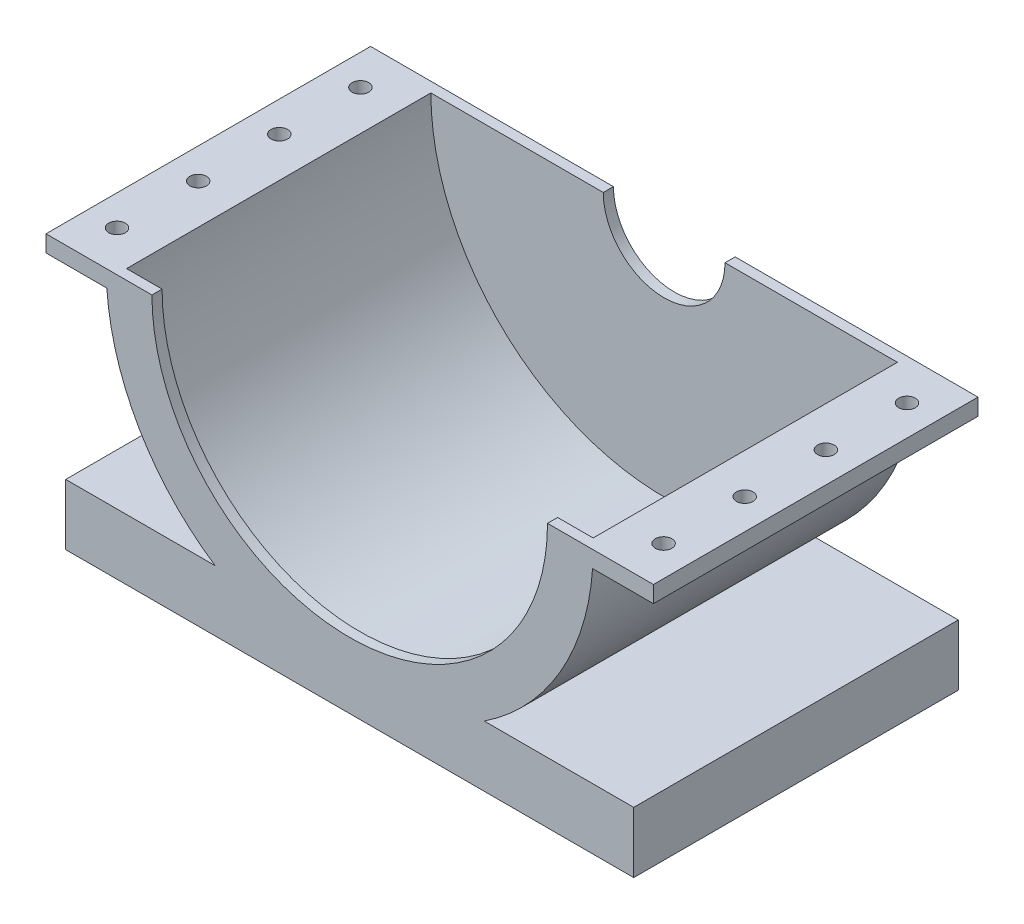
ISO-10303-21;
HEADER;
FILE_DESCRIPTION(('STEP AP214'),'2;1');
FILE_NAME('part.step','',(''),(''),'','','');
FILE_SCHEMA(('AUTOMOTIVE_DESIGN { 1 0 10303 214 1 1 1 1 }'));
ENDSEC;
DATA;
#1=APPLICATION_CONTEXT('core data for automotive mechanical design processes');
#2=APPLICATION_PROTOCOL_DEFINITION('international standard','automotive_design',2000,#1);
#3=PRODUCT_CONTEXT('',#1,'mechanical');
#4=PRODUCT('Part','Part','',(#3));
#5=PRODUCT_RELATED_PRODUCT_CATEGORY('part','',(#4));
#6=PRODUCT_DEFINITION_FORMATION('','',#4);
#7=PRODUCT_DEFINITION_CONTEXT('part definition',#1,'design');
#8=PRODUCT_DEFINITION('design','',#6,#7);
#9=PRODUCT_DEFINITION_SHAPE('','',#8);
#10=(LENGTH_UNIT() NAMED_UNIT(*) SI_UNIT(.MILLI.,.METRE.));
#11=(NAMED_UNIT(*) PLANE_ANGLE_UNIT() SI_UNIT($,.RADIAN.));
#12=(NAMED_UNIT(*) SI_UNIT($,.STERADIAN.) SOLID_ANGLE_UNIT());
#13=UNCERTAINTY_MEASURE_WITH_UNIT(LENGTH_MEASURE(1.E-05),#10,'distance_accuracy_value','');
#14=(GEOMETRIC_REPRESENTATION_CONTEXT(3) GLOBAL_UNCERTAINTY_ASSIGNED_CONTEXT((#13)) GLOBAL_UNIT_ASSIGNED_CONTEXT((#10,
#11,#12)) REPRESENTATION_CONTEXT('',''));
#15=CARTESIAN_POINT('',(0.,0.,0.));
#16=DIRECTION('',(0.,0.,1.));
#17=DIRECTION('',(1.,0.,0.));
#18=AXIS2_PLACEMENT_3D('',#15,#16,#17);
#19=CARTESIAN_POINT('',(-4.875,6.5,8.));
#20=DIRECTION('',(0.,-1.,0.));
#21=DIRECTION('',(0.,0.,-1.));
#22=AXIS2_PLACEMENT_3D('',#19,#20,#21);
#23=PLANE('',#22);
#24=CARTESIAN_POINT('',(6.73597527559211,6.5,7.));
#25=DIRECTION('',(0.,1.,0.));
#26=DIRECTION('',(0.,0.,1.));
#27=AXIS2_PLACEMENT_3D('',#24,#25,#26);
#28=CIRCLE('',#27,0.205000000000002);
#29=CARTESIAN_POINT('',(6.73597527559211,6.5,7.205));
#30=VERTEX_POINT('',#29);
#31=EDGE_CURVE('E262',#30,#30,#28,.T.);
#32=ORIENTED_EDGE('',*,*,#31,.F.);
#33=EDGE_LOOP('',(#32));
#34=FACE_BOUND('',#33,.T.);
#35=CARTESIAN_POINT('',(6.73597527559211,6.5,5.));
#36=DIRECTION('',(0.,1.,0.));
#37=DIRECTION('',(0.,0.,1.));
#38=AXIS2_PLACEMENT_3D('',#35,#36,#37);
#39=CIRCLE('',#38,0.205000000000002);
#40=CARTESIAN_POINT('',(6.73597527559211,6.5,5.205));
#41=VERTEX_POINT('',#40);
#42=EDGE_CURVE('E290',#41,#41,#39,.T.);
#43=ORIENTED_EDGE('',*,*,#42,.F.);
#44=EDGE_LOOP('',(#43));
#45=FACE_BOUND('',#44,.T.);
#46=CARTESIAN_POINT('',(6.73597527559211,6.5,3.));
#47=DIRECTION('',(0.,1.,0.));
#48=DIRECTION('',(0.,0.,1.));
#49=AXIS2_PLACEMENT_3D('',#46,#47,#48);
#50=CIRCLE('',#49,0.205000000000001);
#51=CARTESIAN_POINT('',(6.73597527559211,6.5,3.205));
#52=VERTEX_POINT('',#51);
#53=EDGE_CURVE('E285',#52,#52,#50,.T.);
#54=ORIENTED_EDGE('',*,*,#53,.F.);
#55=EDGE_LOOP('',(#54));
#56=FACE_BOUND('',#55,.T.);
#57=CARTESIAN_POINT('',(6.73597527559211,6.5,1.));
#58=DIRECTION('',(0.,1.,0.));
#59=DIRECTION('',(0.,0.,1.));
#60=AXIS2_PLACEMENT_3D('',#57,#58,#59);
#61=CIRCLE('',#60,0.205000000000001);
#62=CARTESIAN_POINT('',(6.73597527559211,6.5,1.205));
#63=VERTEX_POINT('',#62);
#64=EDGE_CURVE('E281',#63,#63,#61,.T.);
#65=ORIENTED_EDGE('',*,*,#64,.F.);
#66=EDGE_LOOP('',(#65));
#67=FACE_BOUND('',#66,.T.);
#68=DIRECTION('',(-1.,0.,0.));
#69=VECTOR('',#68,1.);
#70=CARTESIAN_POINT('',(-4.875,6.5,0.));
#71=LINE('',#70,#69);
#72=CARTESIAN_POINT('',(7.48597527559211,6.5,0.));
#73=VERTEX_POINT('',#72);
#74=CARTESIAN_POINT('',(1.5,6.5,0.));
#75=VERTEX_POINT('',#74);
#76=EDGE_CURVE('E199',#73,#75,#71,.T.);
#77=ORIENTED_EDGE('',*,*,#76,.T.);
#78=DIRECTION('',(0.,0.,1.));
#79=VECTOR('',#78,1.);
#80=CARTESIAN_POINT('',(1.5,6.5,-3.5));
#81=LINE('',#80,#79);
#82=CARTESIAN_POINT('',(1.5,6.5,0.25));
#83=VERTEX_POINT('',#82);
#84=EDGE_CURVE('E185',#75,#83,#81,.T.);
#85=ORIENTED_EDGE('',*,*,#84,.T.);
#86=DIRECTION('',(-1.,0.,0.));
#87=VECTOR('',#86,1.);
#88=CARTESIAN_POINT('',(5.75,6.5,0.25));
#89=LINE('',#88,#87);
#90=CARTESIAN_POINT('',(5.75,6.5,0.25));
#91=VERTEX_POINT('',#90);
#92=EDGE_CURVE('E306',#91,#83,#89,.T.);
#93=ORIENTED_EDGE('',*,*,#92,.F.);
#94=DIRECTION('',(0.,0.,1.));
#95=VECTOR('',#94,1.);
#96=CARTESIAN_POINT('',(5.75,6.5,0.25));
#97=LINE('',#96,#95);
#98=CARTESIAN_POINT('',(5.75,6.5,7.75));
#99=VERTEX_POINT('',#98);
#100=EDGE_CURVE('E308',#91,#99,#97,.T.);
#101=ORIENTED_EDGE('',*,*,#100,.T.);
#102=DIRECTION('',(-1.,0.,0.));
#103=VECTOR('',#102,1.);
#104=CARTESIAN_POINT('',(5.75,6.5,7.75));
#105=LINE('',#104,#103);
#106=CARTESIAN_POINT('',(4.875,6.5,7.75));
#107=VERTEX_POINT('',#106);
#108=EDGE_CURVE('E305',#99,#107,#105,.T.);
#109=ORIENTED_EDGE('',*,*,#108,.T.);
#110=DIRECTION('',(0.,0.,1.));
#111=VECTOR('',#110,1.);
#112=CARTESIAN_POINT('',(4.875,6.5,4.25));
#113=LINE('',#112,#111);
#114=CARTESIAN_POINT('',(4.875,6.5,8.));
#115=VERTEX_POINT('',#114);
#116=EDGE_CURVE('E85',#107,#115,#113,.T.);
#117=ORIENTED_EDGE('',*,*,#116,.T.);
#118=DIRECTION('',(-1.,0.,0.));
#119=VECTOR('',#118,1.);
#120=CARTESIAN_POINT('',(4.875,6.5,8.));
#121=LINE('',#120,#119);
#122=CARTESIAN_POINT('',(7.48597527559211,6.5,8.));
#123=VERTEX_POINT('',#122);
#124=EDGE_CURVE('E334',#123,#115,#121,.T.);
#125=ORIENTED_EDGE('',*,*,#124,.F.);
#126=DIRECTION('',(0.,0.,-1.));
#127=VECTOR('',#126,1.);
#128=CARTESIAN_POINT('',(7.48597527559211,6.5,8.));
#129=LINE('',#128,#127);
#130=EDGE_CURVE('E207',#123,#73,#129,.T.);
#131=ORIENTED_EDGE('',*,*,#130,.T.);
#132=EDGE_LOOP('',(#77,#85,#93,#101,#109,#117,#125,#131));
#133=FACE_BOUND('',#132,.T.);
#134=ADVANCED_FACE('F61',(#34,#45,#56,#67,#133),#23,.F.);
#135=CARTESIAN_POINT('',(-6.73597527559211,6.5,5.));
#136=DIRECTION('',(0.,-1.,0.));
#137=DIRECTION('',(0.,0.,1.));
#138=AXIS2_PLACEMENT_3D('',#135,#136,#137);
#139=CIRCLE('',#138,0.205000000000002);
#140=CARTESIAN_POINT('',(-6.73597527559211,6.5,5.205));
#141=VERTEX_POINT('',#140);
#142=EDGE_CURVE('E757',#141,#141,#139,.T.);
#143=ORIENTED_EDGE('',*,*,#142,.T.);
#144=EDGE_LOOP('',(#143));
#145=FACE_BOUND('',#144,.T.);
#146=CARTESIAN_POINT('',(-6.73597527559211,6.5,3.));
#147=DIRECTION('',(0.,-1.,0.));
#148=DIRECTION('',(0.,0.,1.));
#149=AXIS2_PLACEMENT_3D('',#146,#147,#148);
#150=CIRCLE('',#149,0.205000000000001);
#151=CARTESIAN_POINT('',(-6.73597527559211,6.5,3.205));
#152=VERTEX_POINT('',#151);
#153=EDGE_CURVE('E758',#152,#152,#150,.T.);
#154=ORIENTED_EDGE('',*,*,#153,.T.);
#155=EDGE_LOOP('',(#154));
#156=FACE_BOUND('',#155,.T.);
#157=CARTESIAN_POINT('',(-6.73597527559211,6.5,1.));
#158=DIRECTION('',(0.,-1.,0.));
#159=DIRECTION('',(0.,0.,1.));
#160=AXIS2_PLACEMENT_3D('',#157,#158,#159);
#161=CIRCLE('',#160,0.205000000000001);
#162=CARTESIAN_POINT('',(-6.73597527559211,6.5,1.205));
#163=VERTEX_POINT('',#162);
#164=EDGE_CURVE('E761',#163,#163,#161,.T.);
#165=ORIENTED_EDGE('',*,*,#164,.T.);
#166=EDGE_LOOP('',(#165));
#167=FACE_BOUND('',#166,.T.);
#168=CARTESIAN_POINT('',(-6.73597527559211,6.5,7.));
#169=DIRECTION('',(0.,-1.,0.));
#170=DIRECTION('',(0.,0.,1.));
#171=AXIS2_PLACEMENT_3D('',#168,#169,#170);
#172=CIRCLE('',#171,0.205000000000002);
#173=CARTESIAN_POINT('',(-6.73597527559211,6.5,7.205));
#174=VERTEX_POINT('',#173);
#175=EDGE_CURVE('E274',#174,#174,#172,.T.);
#176=ORIENTED_EDGE('',*,*,#175,.T.);
#177=EDGE_LOOP('',(#176));
#178=FACE_BOUND('',#177,.T.);
#179=CARTESIAN_POINT('',(-1.5,6.5,0.25));
#180=VERTEX_POINT('',#179);
#181=CARTESIAN_POINT('',(-5.75,6.5,0.25));
#182=VERTEX_POINT('',#181);
#183=EDGE_CURVE('E304',#180,#182,#89,.T.);
#184=ORIENTED_EDGE('',*,*,#183,.F.);
#185=DIRECTION('',(0.,0.,1.));
#186=VECTOR('',#185,1.);
#187=CARTESIAN_POINT('',(-1.5,6.5,-3.5));
#188=LINE('',#187,#186);
#189=CARTESIAN_POINT('',(-1.5,6.5,0.));
#190=VERTEX_POINT('',#189);
#191=EDGE_CURVE('E77',#190,#180,#188,.T.);
#192=ORIENTED_EDGE('',*,*,#191,.F.);
#193=CARTESIAN_POINT('',(-7.48597527559211,6.5,0.));
#194=VERTEX_POINT('',#193);
#195=EDGE_CURVE('E202',#190,#194,#71,.T.);
#196=ORIENTED_EDGE('',*,*,#195,.T.);
#197=DIRECTION('',(0.,0.,-1.));
#198=VECTOR('',#197,1.);
#199=CARTESIAN_POINT('',(-7.48597527559211,6.5,8.));
#200=LINE('',#199,#198);
#201=CARTESIAN_POINT('',(-7.48597527559211,6.5,8.));
#202=VERTEX_POINT('',#201);
#203=EDGE_CURVE('E235',#202,#194,#200,.T.);
#204=ORIENTED_EDGE('',*,*,#203,.F.);
#205=CARTESIAN_POINT('',(-4.875,6.5,8.));
#206=VERTEX_POINT('',#205);
#207=EDGE_CURVE('E333',#206,#202,#121,.T.);
#208=ORIENTED_EDGE('',*,*,#207,.F.);
#209=DIRECTION('',(0.,0.,1.));
#210=VECTOR('',#209,1.);
#211=CARTESIAN_POINT('',(-4.875,6.5,4.25));
#212=LINE('',#211,#210);
#213=CARTESIAN_POINT('',(-4.875,6.5,7.75));
#214=VERTEX_POINT('',#213);
#215=EDGE_CURVE('E295',#214,#206,#212,.T.);
#216=ORIENTED_EDGE('',*,*,#215,.F.);
#217=CARTESIAN_POINT('',(-5.75,6.5,7.75));
#218=VERTEX_POINT('',#217);
#219=EDGE_CURVE('E310',#214,#218,#105,.T.);
#220=ORIENTED_EDGE('',*,*,#219,.T.);
#221=DIRECTION('',(0.,0.,1.));
#222=VECTOR('',#221,1.);
#223=CARTESIAN_POINT('',(-5.75,6.5,0.25));
#224=LINE('',#223,#222);
#225=EDGE_CURVE('E313',#182,#218,#224,.T.);
#226=ORIENTED_EDGE('',*,*,#225,.F.);
#227=EDGE_LOOP('',(#184,#192,#196,#204,#208,#216,#220,#226));
#228=FACE_BOUND('',#227,.T.);
#229=ADVANCED_FACE('F410',(#145,#156,#167,#178,#228),#23,.F.);
#230=CARTESIAN_POINT('',(-7.,0.,8.));
#231=DIRECTION('',(1.,0.,0.));
#232=DIRECTION('',(0.,1.,0.));
#233=AXIS2_PLACEMENT_3D('',#230,#231,#232);
#234=PLANE('',#233);
#235=DIRECTION('',(0.,-1.,0.));
#236=VECTOR('',#235,1.);
#237=CARTESIAN_POINT('',(-7.,0.,0.));
#238=LINE('',#237,#236);
#239=CARTESIAN_POINT('',(-7.,1.5,0.));
#240=VERTEX_POINT('',#239);
#241=CARTESIAN_POINT('',(-7.,0.,0.));
#242=VERTEX_POINT('',#241);
#243=EDGE_CURVE('E316',#240,#242,#238,.T.);
#244=ORIENTED_EDGE('',*,*,#243,.T.);
#245=DIRECTION('',(0.,0.,-1.));
#246=VECTOR('',#245,1.);
#247=CARTESIAN_POINT('',(-7.,0.,8.));
#248=LINE('',#247,#246);
#249=CARTESIAN_POINT('',(-7.,0.,8.));
#250=VERTEX_POINT('',#249);
#251=EDGE_CURVE('E254',#250,#242,#248,.T.);
#252=ORIENTED_EDGE('',*,*,#251,.F.);
#253=DIRECTION('',(0.,-1.,0.));
#254=VECTOR('',#253,1.);
#255=CARTESIAN_POINT('',(-7.,0.,8.));
#256=LINE('',#255,#254);
#257=CARTESIAN_POINT('',(-7.,1.5,8.));
#258=VERTEX_POINT('',#257);
#259=EDGE_CURVE('E221',#258,#250,#256,.T.);
#260=ORIENTED_EDGE('',*,*,#259,.F.);
#261=DIRECTION('',(0.,0.,-1.));
#262=VECTOR('',#261,1.);
#263=CARTESIAN_POINT('',(-7.,1.5,8.));
#264=LINE('',#263,#262);
#265=EDGE_CURVE('E222',#258,#240,#264,.T.);
#266=ORIENTED_EDGE('',*,*,#265,.T.);
#267=EDGE_LOOP('',(#244,#252,#260,#266));
#268=FACE_BOUND('',#267,.T.);
#269=ADVANCED_FACE('F63',(#268),#234,.F.);
#270=CARTESIAN_POINT('',(-7.,0.,8.));
#271=DIRECTION('',(0.,1.,0.));
#272=DIRECTION('',(0.,0.,1.));
#273=AXIS2_PLACEMENT_3D('',#270,#271,#272);
#274=PLANE('',#273);
#275=DIRECTION('',(1.,0.,0.));
#276=VECTOR('',#275,1.);
#277=CARTESIAN_POINT('',(-7.,0.,0.));
#278=LINE('',#277,#276);
#279=CARTESIAN_POINT('',(7.,0.,0.));
#280=VERTEX_POINT('',#279);
#281=EDGE_CURVE('E346',#242,#280,#278,.T.);
#282=ORIENTED_EDGE('',*,*,#281,.T.);
#283=DIRECTION('',(0.,0.,-1.));
#284=VECTOR('',#283,1.);
#285=CARTESIAN_POINT('',(7.,0.,8.));
#286=LINE('',#285,#284);
#287=CARTESIAN_POINT('',(7.,0.,8.));
#288=VERTEX_POINT('',#287);
#289=EDGE_CURVE('E251',#288,#280,#286,.T.);
#290=ORIENTED_EDGE('',*,*,#289,.F.);
#291=DIRECTION('',(1.,0.,0.));
#292=VECTOR('',#291,1.);
#293=CARTESIAN_POINT('',(-7.,0.,8.));
#294=LINE('',#293,#292);
#295=EDGE_CURVE('E321',#250,#288,#294,.T.);
#296=ORIENTED_EDGE('',*,*,#295,.F.);
#297=ORIENTED_EDGE('',*,*,#251,.T.);
#298=EDGE_LOOP('',(#282,#290,#296,#297));
#299=FACE_BOUND('',#298,.T.);
#300=ADVANCED_FACE('F385',(#299),#274,.F.);
#301=CARTESIAN_POINT('',(7.,0.,8.));
#302=DIRECTION('',(-1.,0.,0.));
#303=DIRECTION('',(0.,-1.,0.));
#304=AXIS2_PLACEMENT_3D('',#301,#302,#303);
#305=PLANE('',#304);
#306=DIRECTION('',(0.,1.,0.));
#307=VECTOR('',#306,1.);
#308=CARTESIAN_POINT('',(7.,0.,0.));
#309=LINE('',#308,#307);
#310=CARTESIAN_POINT('',(7.,1.5,0.));
#311=VERTEX_POINT('',#310);
#312=EDGE_CURVE('E348',#280,#311,#309,.T.);
#313=ORIENTED_EDGE('',*,*,#312,.T.);
#314=DIRECTION('',(0.,0.,-1.));
#315=VECTOR('',#314,1.);
#316=CARTESIAN_POINT('',(7.,1.5,8.));
#317=LINE('',#316,#315);
#318=CARTESIAN_POINT('',(7.,1.5,8.));
#319=VERTEX_POINT('',#318);
#320=EDGE_CURVE('E248',#319,#311,#317,.T.);
#321=ORIENTED_EDGE('',*,*,#320,.F.);
#322=DIRECTION('',(0.,1.,0.));
#323=VECTOR('',#322,1.);
#324=CARTESIAN_POINT('',(7.,0.,8.));
#325=LINE('',#324,#323);
#326=EDGE_CURVE('E323',#288,#319,#325,.T.);
#327=ORIENTED_EDGE('',*,*,#326,.F.);
#328=ORIENTED_EDGE('',*,*,#289,.T.);
#329=EDGE_LOOP('',(#313,#321,#327,#328));
#330=FACE_BOUND('',#329,.T.);
#331=ADVANCED_FACE('F379',(#330),#305,.F.);
#332=CARTESIAN_POINT('',(7.,1.5,8.));
#333=DIRECTION('',(0.,-1.,0.));
#334=DIRECTION('',(1.,0.,0.));
#335=AXIS2_PLACEMENT_3D('',#332,#333,#334);
#336=PLANE('',#335);
#337=DIRECTION('',(-1.,0.,0.));
#338=VECTOR('',#337,1.);
#339=CARTESIAN_POINT('',(7.,1.5,0.));
#340=LINE('',#339,#338);
#341=CARTESIAN_POINT('',(3.3166247903554,1.5,0.));
#342=VERTEX_POINT('',#341);
#343=EDGE_CURVE('E350',#311,#342,#340,.T.);
#344=ORIENTED_EDGE('',*,*,#343,.T.);
#345=DIRECTION('',(0.,0.,-1.));
#346=VECTOR('',#345,1.);
#347=CARTESIAN_POINT('',(3.3166247903554,1.5,8.));
#348=LINE('',#347,#346);
#349=CARTESIAN_POINT('',(3.3166247903554,1.5,8.));
#350=VERTEX_POINT('',#349);
#351=EDGE_CURVE('E245',#350,#342,#348,.T.);
#352=ORIENTED_EDGE('',*,*,#351,.F.);
#353=DIRECTION('',(-1.,0.,0.));
#354=VECTOR('',#353,1.);
#355=CARTESIAN_POINT('',(7.,1.5,8.));
#356=LINE('',#355,#354);
#357=EDGE_CURVE('E325',#319,#350,#356,.T.);
#358=ORIENTED_EDGE('',*,*,#357,.F.);
#359=ORIENTED_EDGE('',*,*,#320,.T.);
#360=EDGE_LOOP('',(#344,#352,#358,#359));
#361=FACE_BOUND('',#360,.T.);
#362=ADVANCED_FACE('F377',(#361),#336,.F.);
#363=CARTESIAN_POINT('',(0.,6.5,8.));
#364=DIRECTION('',(0.,0.,-1.));
#365=DIRECTION('',(-1.,0.,0.));
#366=AXIS2_PLACEMENT_3D('',#363,#364,#365);
#367=CYLINDRICAL_SURFACE('',#366,6.);
#368=CARTESIAN_POINT('',(0.,6.5,0.));
#369=DIRECTION('',(0.,0.,1.));
#370=DIRECTION('',(-1.,0.,0.));
#371=AXIS2_PLACEMENT_3D('',#368,#369,#370);
#372=CIRCLE('',#371,6.);
#373=CARTESIAN_POINT('',(5.98597527559211,6.09,0.));
#374=VERTEX_POINT('',#373);
#375=EDGE_CURVE('E352',#342,#374,#372,.T.);
#376=ORIENTED_EDGE('',*,*,#375,.T.);
#377=DIRECTION('',(0.,0.,-1.));
#378=VECTOR('',#377,1.);
#379=CARTESIAN_POINT('',(5.98597527559211,6.09,8.));
#380=LINE('',#379,#378);
#381=CARTESIAN_POINT('',(5.98597527559211,6.09,8.));
#382=VERTEX_POINT('',#381);
#383=EDGE_CURVE('E242',#382,#374,#380,.T.);
#384=ORIENTED_EDGE('',*,*,#383,.F.);
#385=CARTESIAN_POINT('',(0.,6.5,8.));
#386=DIRECTION('',(0.,0.,1.));
#387=DIRECTION('',(-1.,0.,0.));
#388=AXIS2_PLACEMENT_3D('',#385,#386,#387);
#389=CIRCLE('',#388,6.);
#390=EDGE_CURVE('E327',#350,#382,#389,.T.);
#391=ORIENTED_EDGE('',*,*,#390,.F.);
#392=ORIENTED_EDGE('',*,*,#351,.T.);
#393=EDGE_LOOP('',(#376,#384,#391,#392));
#394=FACE_BOUND('',#393,.T.);
#395=ADVANCED_FACE('F365',(#394),#367,.T.);
#396=CARTESIAN_POINT('',(7.48597527559211,6.09,8.));
#397=DIRECTION('',(0.,1.,0.));
#398=DIRECTION('',(-1.,0.,0.));
#399=AXIS2_PLACEMENT_3D('',#396,#397,#398);
#400=PLANE('',#399);
#401=CARTESIAN_POINT('',(6.73597527559211,6.09,7.));
#402=DIRECTION('',(0.,1.,0.));
#403=DIRECTION('',(-1.,0.,0.));
#404=AXIS2_PLACEMENT_3D('',#401,#402,#403);
#405=CIRCLE('',#404,0.205000000000002);
#406=CARTESIAN_POINT('',(6.53097527559211,6.09,7.));
#407=VERTEX_POINT('',#406);
#408=EDGE_CURVE('E193',#407,#407,#405,.T.);
#409=ORIENTED_EDGE('',*,*,#408,.T.);
#410=EDGE_LOOP('',(#409));
#411=FACE_BOUND('',#410,.T.);
#412=CARTESIAN_POINT('',(6.73597527559211,6.09,5.));
#413=DIRECTION('',(0.,1.,0.));
#414=DIRECTION('',(-1.,0.,0.));
#415=AXIS2_PLACEMENT_3D('',#412,#413,#414);
#416=CIRCLE('',#415,0.205000000000002);
#417=CARTESIAN_POINT('',(6.53097527559211,6.09,5.));
#418=VERTEX_POINT('',#417);
#419=EDGE_CURVE('E265',#418,#418,#416,.T.);
#420=ORIENTED_EDGE('',*,*,#419,.T.);
#421=EDGE_LOOP('',(#420));
#422=FACE_BOUND('',#421,.T.);
#423=CARTESIAN_POINT('',(6.73597527559211,6.09,3.));
#424=DIRECTION('',(0.,1.,0.));
#425=DIRECTION('',(-1.,0.,0.));
#426=AXIS2_PLACEMENT_3D('',#423,#424,#425);
#427=CIRCLE('',#426,0.205000000000001);
#428=CARTESIAN_POINT('',(6.53097527559211,6.09,3.));
#429=VERTEX_POINT('',#428);
#430=EDGE_CURVE('E261',#429,#429,#427,.T.);
#431=ORIENTED_EDGE('',*,*,#430,.T.);
#432=EDGE_LOOP('',(#431));
#433=FACE_BOUND('',#432,.T.);
#434=CARTESIAN_POINT('',(6.73597527559211,6.09,1.));
#435=DIRECTION('',(0.,1.,0.));
#436=DIRECTION('',(-1.,0.,0.));
#437=AXIS2_PLACEMENT_3D('',#434,#435,#436);
#438=CIRCLE('',#437,0.205000000000001);
#439=CARTESIAN_POINT('',(6.53097527559211,6.09,1.));
#440=VERTEX_POINT('',#439);
#441=EDGE_CURVE('E258',#440,#440,#438,.T.);
#442=ORIENTED_EDGE('',*,*,#441,.T.);
#443=EDGE_LOOP('',(#442));
#444=FACE_BOUND('',#443,.T.);
#445=DIRECTION('',(1.,0.,0.));
#446=VECTOR('',#445,1.);
#447=CARTESIAN_POINT('',(7.48597527559211,6.09,0.));
#448=LINE('',#447,#446);
#449=CARTESIAN_POINT('',(7.48597527559211,6.09,0.));
#450=VERTEX_POINT('',#449);
#451=EDGE_CURVE('E353',#374,#450,#448,.T.);
#452=ORIENTED_EDGE('',*,*,#451,.T.);
#453=DIRECTION('',(0.,0.,-1.));
#454=VECTOR('',#453,1.);
#455=CARTESIAN_POINT('',(7.48597527559211,6.09,8.));
#456=LINE('',#455,#454);
#457=CARTESIAN_POINT('',(7.48597527559211,6.09,8.));
#458=VERTEX_POINT('',#457);
#459=EDGE_CURVE('E239',#458,#450,#456,.T.);
#460=ORIENTED_EDGE('',*,*,#459,.F.);
#461=DIRECTION('',(1.,0.,0.));
#462=VECTOR('',#461,1.);
#463=CARTESIAN_POINT('',(7.48597527559211,6.09,8.));
#464=LINE('',#463,#462);
#465=EDGE_CURVE('E329',#382,#458,#464,.T.);
#466=ORIENTED_EDGE('',*,*,#465,.F.);
#467=ORIENTED_EDGE('',*,*,#383,.T.);
#468=EDGE_LOOP('',(#452,#460,#466,#467));
#469=FACE_BOUND('',#468,.T.);
#470=ADVANCED_FACE('F369',(#411,#422,#433,#444,#469),#400,.F.);
#471=CARTESIAN_POINT('',(7.48597527559211,6.5,8.));
#472=DIRECTION('',(-1.,0.,0.));
#473=DIRECTION('',(0.,0.,1.));
#474=AXIS2_PLACEMENT_3D('',#471,#472,#473);
#475=PLANE('',#474);
#476=DIRECTION('',(0.,1.,0.));
#477=VECTOR('',#476,1.);
#478=CARTESIAN_POINT('',(7.48597527559211,6.5,0.));
#479=LINE('',#478,#477);
#480=EDGE_CURVE('E212',#450,#73,#479,.T.);
#481=ORIENTED_EDGE('',*,*,#480,.T.);
#482=ORIENTED_EDGE('',*,*,#130,.F.);
#483=DIRECTION('',(0.,1.,0.));
#484=VECTOR('',#483,1.);
#485=CARTESIAN_POINT('',(7.48597527559211,6.5,8.));
#486=LINE('',#485,#484);
#487=EDGE_CURVE('E331',#458,#123,#486,.T.);
#488=ORIENTED_EDGE('',*,*,#487,.F.);
#489=ORIENTED_EDGE('',*,*,#459,.T.);
#490=EDGE_LOOP('',(#481,#482,#488,#489));
#491=FACE_BOUND('',#490,.T.);
#492=ADVANCED_FACE('F358',(#491),#475,.F.);
#493=CARTESIAN_POINT('',(-7.48597527559211,6.5,8.));
#494=DIRECTION('',(1.,0.,0.));
#495=DIRECTION('',(0.,0.,-1.));
#496=AXIS2_PLACEMENT_3D('',#493,#494,#495);
#497=PLANE('',#496);
#498=DIRECTION('',(0.,-1.,0.));
#499=VECTOR('',#498,1.);
#500=CARTESIAN_POINT('',(-7.48597527559211,6.5,0.));
#501=LINE('',#500,#499);
#502=CARTESIAN_POINT('',(-7.48597527559211,6.09,0.));
#503=VERTEX_POINT('',#502);
#504=EDGE_CURVE('E208',#194,#503,#501,.T.);
#505=ORIENTED_EDGE('',*,*,#504,.T.);
#506=DIRECTION('',(0.,0.,-1.));
#507=VECTOR('',#506,1.);
#508=CARTESIAN_POINT('',(-7.48597527559211,6.09,8.));
#509=LINE('',#508,#507);
#510=CARTESIAN_POINT('',(-7.48597527559211,6.09,8.));
#511=VERTEX_POINT('',#510);
#512=EDGE_CURVE('E232',#511,#503,#509,.T.);
#513=ORIENTED_EDGE('',*,*,#512,.F.);
#514=DIRECTION('',(0.,-1.,0.));
#515=VECTOR('',#514,1.);
#516=CARTESIAN_POINT('',(-7.48597527559211,6.5,8.));
#517=LINE('',#516,#515);
#518=EDGE_CURVE('E337',#202,#511,#517,.T.);
#519=ORIENTED_EDGE('',*,*,#518,.F.);
#520=ORIENTED_EDGE('',*,*,#203,.T.);
#521=EDGE_LOOP('',(#505,#513,#519,#520));
#522=FACE_BOUND('',#521,.T.);
#523=ADVANCED_FACE('F405',(#522),#497,.F.);
#524=CARTESIAN_POINT('',(-7.48597527559211,6.09,8.));
#525=DIRECTION('',(0.,1.,0.));
#526=DIRECTION('',(-1.,0.,0.));
#527=AXIS2_PLACEMENT_3D('',#524,#525,#526);
#528=PLANE('',#527);
#529=CARTESIAN_POINT('',(-6.73597527559211,6.09,5.));
#530=DIRECTION('',(0.,1.,0.));
#531=DIRECTION('',(-1.,0.,0.));
#532=AXIS2_PLACEMENT_3D('',#529,#530,#531);
#533=CIRCLE('',#532,0.205000000000002);
#534=CARTESIAN_POINT('',(-6.94097527559211,6.09,5.));
#535=VERTEX_POINT('',#534);
#536=EDGE_CURVE('E65',#535,#535,#533,.F.);
#537=ORIENTED_EDGE('',*,*,#536,.F.);
#538=EDGE_LOOP('',(#537));
#539=FACE_BOUND('',#538,.T.);
#540=CARTESIAN_POINT('',(-6.73597527559211,6.09,3.));
#541=DIRECTION('',(0.,1.,0.));
#542=DIRECTION('',(-1.,0.,0.));
#543=AXIS2_PLACEMENT_3D('',#540,#541,#542);
#544=CIRCLE('',#543,0.205000000000001);
#545=CARTESIAN_POINT('',(-6.94097527559211,6.09,3.));
#546=VERTEX_POINT('',#545);
#547=EDGE_CURVE('E276',#546,#546,#544,.F.);
#548=ORIENTED_EDGE('',*,*,#547,.F.);
#549=EDGE_LOOP('',(#548));
#550=FACE_BOUND('',#549,.T.);
#551=CARTESIAN_POINT('',(-6.73597527559211,6.09,1.));
#552=DIRECTION('',(0.,1.,0.));
#553=DIRECTION('',(-1.,0.,0.));
#554=AXIS2_PLACEMENT_3D('',#551,#552,#553);
#555=CIRCLE('',#554,0.205000000000001);
#556=CARTESIAN_POINT('',(-6.94097527559211,6.09,1.));
#557=VERTEX_POINT('',#556);
#558=EDGE_CURVE('E273',#557,#557,#555,.F.);
#559=ORIENTED_EDGE('',*,*,#558,.F.);
#560=EDGE_LOOP('',(#559));
#561=FACE_BOUND('',#560,.T.);
#562=CARTESIAN_POINT('',(-6.73597527559211,6.09,7.));
#563=DIRECTION('',(0.,1.,0.));
#564=DIRECTION('',(-1.,0.,0.));
#565=AXIS2_PLACEMENT_3D('',#562,#563,#564);
#566=CIRCLE('',#565,0.205000000000002);
#567=CARTESIAN_POINT('',(-6.94097527559211,6.09,7.));
#568=VERTEX_POINT('',#567);
#569=EDGE_CURVE('E270',#568,#568,#566,.F.);
#570=ORIENTED_EDGE('',*,*,#569,.F.);
#571=EDGE_LOOP('',(#570));
#572=FACE_BOUND('',#571,.T.);
#573=DIRECTION('',(1.,0.,0.));
#574=VECTOR('',#573,1.);
#575=CARTESIAN_POINT('',(-7.48597527559211,6.09,0.));
#576=LINE('',#575,#574);
#577=CARTESIAN_POINT('',(-5.98597527559211,6.09,0.));
#578=VERTEX_POINT('',#577);
#579=EDGE_CURVE('E210',#503,#578,#576,.T.);
#580=ORIENTED_EDGE('',*,*,#579,.T.);
#581=DIRECTION('',(0.,0.,-1.));
#582=VECTOR('',#581,1.);
#583=CARTESIAN_POINT('',(-5.98597527559211,6.09,8.));
#584=LINE('',#583,#582);
#585=CARTESIAN_POINT('',(-5.98597527559211,6.09,8.));
#586=VERTEX_POINT('',#585);
#587=EDGE_CURVE('E229',#586,#578,#584,.T.);
#588=ORIENTED_EDGE('',*,*,#587,.F.);
#589=DIRECTION('',(1.,0.,0.));
#590=VECTOR('',#589,1.);
#591=CARTESIAN_POINT('',(-7.48597527559211,6.09,8.));
#592=LINE('',#591,#590);
#593=EDGE_CURVE('E339',#511,#586,#592,.T.);
#594=ORIENTED_EDGE('',*,*,#593,.F.);
#595=ORIENTED_EDGE('',*,*,#512,.T.);
#596=EDGE_LOOP('',(#580,#588,#594,#595));
#597=FACE_BOUND('',#596,.T.);
#598=ADVANCED_FACE('F401',(#539,#550,#561,#572,#597),#528,.F.);
#599=CARTESIAN_POINT('',(0.,6.5,8.));
#600=DIRECTION('',(0.,0.,-1.));
#601=DIRECTION('',(-1.,0.,0.));
#602=AXIS2_PLACEMENT_3D('',#599,#600,#601);
#603=CYLINDRICAL_SURFACE('',#602,6.);
#604=CARTESIAN_POINT('',(0.,6.5,0.));
#605=DIRECTION('',(0.,0.,1.));
#606=DIRECTION('',(1.,0.,0.));
#607=AXIS2_PLACEMENT_3D('',#604,#605,#606);
#608=CIRCLE('',#607,6.);
#609=CARTESIAN_POINT('',(-3.3166247903554,1.5,0.));
#610=VERTEX_POINT('',#609);
#611=EDGE_CURVE('E217',#578,#610,#608,.T.);
#612=ORIENTED_EDGE('',*,*,#611,.T.);
#613=DIRECTION('',(0.,0.,-1.));
#614=VECTOR('',#613,1.);
#615=CARTESIAN_POINT('',(-3.3166247903554,1.5,8.));
#616=LINE('',#615,#614);
#617=CARTESIAN_POINT('',(-3.3166247903554,1.5,8.));
#618=VERTEX_POINT('',#617);
#619=EDGE_CURVE('E225',#618,#610,#616,.T.);
#620=ORIENTED_EDGE('',*,*,#619,.F.);
#621=CARTESIAN_POINT('',(0.,6.5,8.));
#622=DIRECTION('',(0.,0.,1.));
#623=DIRECTION('',(1.,0.,0.));
#624=AXIS2_PLACEMENT_3D('',#621,#622,#623);
#625=CIRCLE('',#624,6.);
#626=EDGE_CURVE('E341',#586,#618,#625,.T.);
#627=ORIENTED_EDGE('',*,*,#626,.F.);
#628=ORIENTED_EDGE('',*,*,#587,.T.);
#629=EDGE_LOOP('',(#612,#620,#627,#628));
#630=FACE_BOUND('',#629,.T.);
#631=ADVANCED_FACE('F396',(#630),#603,.T.);
#632=CARTESIAN_POINT('',(-7.,1.5,8.));
#633=DIRECTION('',(0.,-1.,0.));
#634=DIRECTION('',(1.,0.,0.));
#635=AXIS2_PLACEMENT_3D('',#632,#633,#634);
#636=PLANE('',#635);
#637=DIRECTION('',(-1.,0.,0.));
#638=VECTOR('',#637,1.);
#639=CARTESIAN_POINT('',(-7.,1.5,0.));
#640=LINE('',#639,#638);
#641=EDGE_CURVE('E219',#610,#240,#640,.T.);
#642=ORIENTED_EDGE('',*,*,#641,.T.);
#643=ORIENTED_EDGE('',*,*,#265,.F.);
#644=DIRECTION('',(-1.,0.,0.));
#645=VECTOR('',#644,1.);
#646=CARTESIAN_POINT('',(-7.,1.5,8.));
#647=LINE('',#646,#645);
#648=EDGE_CURVE('E226',#618,#258,#647,.T.);
#649=ORIENTED_EDGE('',*,*,#648,.F.);
#650=ORIENTED_EDGE('',*,*,#619,.T.);
#651=EDGE_LOOP('',(#642,#643,#649,#650));
#652=FACE_BOUND('',#651,.T.);
#653=ADVANCED_FACE('F391',(#652),#636,.F.);
#654=CARTESIAN_POINT('',(0.,6.5,8.));
#655=DIRECTION('',(0.,0.,1.));
#656=DIRECTION('',(1.,0.,0.));
#657=AXIS2_PLACEMENT_3D('',#654,#655,#656);
#658=PLANE('',#657);
#659=CARTESIAN_POINT('',(0.,6.5,8.));
#660=DIRECTION('',(0.,0.,1.));
#661=DIRECTION('',(1.,0.,0.));
#662=AXIS2_PLACEMENT_3D('',#659,#660,#661);
#663=CIRCLE('',#662,4.875);
#664=EDGE_CURVE('E297',#206,#115,#663,.T.);
#665=ORIENTED_EDGE('',*,*,#664,.F.);
#666=ORIENTED_EDGE('',*,*,#207,.T.);
#667=ORIENTED_EDGE('',*,*,#518,.T.);
#668=ORIENTED_EDGE('',*,*,#593,.T.);
#669=ORIENTED_EDGE('',*,*,#626,.T.);
#670=ORIENTED_EDGE('',*,*,#648,.T.);
#671=ORIENTED_EDGE('',*,*,#259,.T.);
#672=ORIENTED_EDGE('',*,*,#295,.T.);
#673=ORIENTED_EDGE('',*,*,#326,.T.);
#674=ORIENTED_EDGE('',*,*,#357,.T.);
#675=ORIENTED_EDGE('',*,*,#390,.T.);
#676=ORIENTED_EDGE('',*,*,#465,.T.);
#677=ORIENTED_EDGE('',*,*,#487,.T.);
#678=ORIENTED_EDGE('',*,*,#124,.T.);
#679=EDGE_LOOP('',(#665,#666,#667,#668,#669,#670,#671,#672,#673,#674,#675,#676,#677,#678));
#680=FACE_BOUND('',#679,.T.);
#681=ADVANCED_FACE('F372',(#680),#658,.T.);
#682=CARTESIAN_POINT('',(0.,6.5,0.));
#683=DIRECTION('',(0.,0.,1.));
#684=DIRECTION('',(1.,0.,0.));
#685=AXIS2_PLACEMENT_3D('',#682,#683,#684);
#686=PLANE('',#685);
#687=ORIENTED_EDGE('',*,*,#195,.F.);
#688=CARTESIAN_POINT('',(0.,6.5,0.));
#689=DIRECTION('',(0.,0.,1.));
#690=DIRECTION('',(1.,0.,0.));
#691=AXIS2_PLACEMENT_3D('',#688,#689,#690);
#692=CIRCLE('',#691,1.5);
#693=EDGE_CURVE('E188',#190,#75,#692,.T.);
#694=ORIENTED_EDGE('',*,*,#693,.T.);
#695=ORIENTED_EDGE('',*,*,#76,.F.);
#696=ORIENTED_EDGE('',*,*,#480,.F.);
#697=ORIENTED_EDGE('',*,*,#451,.F.);
#698=ORIENTED_EDGE('',*,*,#375,.F.);
#699=ORIENTED_EDGE('',*,*,#343,.F.);
#700=ORIENTED_EDGE('',*,*,#312,.F.);
#701=ORIENTED_EDGE('',*,*,#281,.F.);
#702=ORIENTED_EDGE('',*,*,#243,.F.);
#703=ORIENTED_EDGE('',*,*,#641,.F.);
#704=ORIENTED_EDGE('',*,*,#611,.F.);
#705=ORIENTED_EDGE('',*,*,#579,.F.);
#706=ORIENTED_EDGE('',*,*,#504,.F.);
#707=EDGE_LOOP('',(#687,#694,#695,#696,#697,#698,#699,#700,#701,#702,#703,#704,#705,#706));
#708=FACE_BOUND('',#707,.T.);
#709=ADVANCED_FACE('F197',(#708),#686,.F.);
#710=CARTESIAN_POINT('',(0.,6.5,0.25));
#711=DIRECTION('',(0.,0.,1.));
#712=DIRECTION('',(1.,0.,0.));
#713=AXIS2_PLACEMENT_3D('',#710,#711,#712);
#714=CYLINDRICAL_SURFACE('',#713,5.75);
#715=CARTESIAN_POINT('',(0.,6.5,7.75));
#716=DIRECTION('',(0.,0.,1.));
#717=DIRECTION('',(1.,0.,0.));
#718=AXIS2_PLACEMENT_3D('',#715,#716,#717);
#719=CIRCLE('',#718,5.75);
#720=EDGE_CURVE('E300',#218,#99,#719,.T.);
#721=ORIENTED_EDGE('',*,*,#720,.T.);
#722=ORIENTED_EDGE('',*,*,#100,.F.);
#723=CARTESIAN_POINT('',(0.,6.5,0.25));
#724=DIRECTION('',(0.,0.,1.));
#725=DIRECTION('',(1.,0.,0.));
#726=AXIS2_PLACEMENT_3D('',#723,#724,#725);
#727=CIRCLE('',#726,5.75);
#728=EDGE_CURVE('E301',#182,#91,#727,.T.);
#729=ORIENTED_EDGE('',*,*,#728,.F.);
#730=ORIENTED_EDGE('',*,*,#225,.T.);
#731=EDGE_LOOP('',(#721,#722,#729,#730));
#732=FACE_BOUND('',#731,.T.);
#733=ADVANCED_FACE('F417',(#732),#714,.F.);
#734=CARTESIAN_POINT('',(0.,6.5,0.25));
#735=DIRECTION('',(0.,0.,1.));
#736=DIRECTION('',(1.,0.,0.));
#737=AXIS2_PLACEMENT_3D('',#734,#735,#736);
#738=PLANE('',#737);
#739=CARTESIAN_POINT('',(0.,6.5,0.25));
#740=DIRECTION('',(0.,0.,1.));
#741=DIRECTION('',(1.,0.,0.));
#742=AXIS2_PLACEMENT_3D('',#739,#740,#741);
#743=CIRCLE('',#742,1.5);
#744=EDGE_CURVE('E12',#180,#83,#743,.T.);
#745=ORIENTED_EDGE('',*,*,#744,.F.);
#746=ORIENTED_EDGE('',*,*,#183,.T.);
#747=ORIENTED_EDGE('',*,*,#728,.T.);
#748=ORIENTED_EDGE('',*,*,#92,.T.);
#749=EDGE_LOOP('',(#745,#746,#747,#748));
#750=FACE_BOUND('',#749,.T.);
#751=ADVANCED_FACE('F415',(#750),#738,.T.);
#752=CARTESIAN_POINT('',(0.,6.5,7.75));
#753=DIRECTION('',(0.,0.,1.));
#754=DIRECTION('',(1.,0.,0.));
#755=AXIS2_PLACEMENT_3D('',#752,#753,#754);
#756=PLANE('',#755);
#757=ORIENTED_EDGE('',*,*,#219,.F.);
#758=CARTESIAN_POINT('',(0.,6.5,7.75));
#759=DIRECTION('',(0.,0.,1.));
#760=DIRECTION('',(1.,0.,0.));
#761=AXIS2_PLACEMENT_3D('',#758,#759,#760);
#762=CIRCLE('',#761,4.875);
#763=EDGE_CURVE('E70',#214,#107,#762,.T.);
#764=ORIENTED_EDGE('',*,*,#763,.T.);
#765=ORIENTED_EDGE('',*,*,#108,.F.);
#766=ORIENTED_EDGE('',*,*,#720,.F.);
#767=EDGE_LOOP('',(#757,#764,#765,#766));
#768=FACE_BOUND('',#767,.T.);
#769=ADVANCED_FACE('F422',(#768),#756,.F.);
#770=CARTESIAN_POINT('',(0.,6.5,4.25));
#771=DIRECTION('',(0.,0.,1.));
#772=DIRECTION('',(1.,0.,0.));
#773=AXIS2_PLACEMENT_3D('',#770,#771,#772);
#774=CYLINDRICAL_SURFACE('',#773,4.875);
#775=ORIENTED_EDGE('',*,*,#664,.T.);
#776=ORIENTED_EDGE('',*,*,#116,.F.);
#777=ORIENTED_EDGE('',*,*,#763,.F.);
#778=ORIENTED_EDGE('',*,*,#215,.T.);
#779=EDGE_LOOP('',(#775,#776,#777,#778));
#780=FACE_BOUND('',#779,.T.);
#781=ADVANCED_FACE('F423',(#780),#774,.F.);
#782=CARTESIAN_POINT('',(0.,6.5,-3.5));
#783=DIRECTION('',(0.,0.,1.));
#784=DIRECTION('',(1.,0.,0.));
#785=AXIS2_PLACEMENT_3D('',#782,#783,#784);
#786=CYLINDRICAL_SURFACE('',#785,1.5);
#787=ORIENTED_EDGE('',*,*,#191,.T.);
#788=ORIENTED_EDGE('',*,*,#744,.T.);
#789=ORIENTED_EDGE('',*,*,#84,.F.);
#790=ORIENTED_EDGE('',*,*,#693,.F.);
#791=EDGE_LOOP('',(#787,#788,#789,#790));
#792=FACE_BOUND('',#791,.T.);
#793=ADVANCED_FACE('F187',(#792),#786,.F.);
#794=CARTESIAN_POINT('',(6.73597527559211,4.5,1.));
#795=DIRECTION('',(0.,1.,0.));
#796=DIRECTION('',(0.,0.,1.));
#797=AXIS2_PLACEMENT_3D('',#794,#795,#796);
#798=CYLINDRICAL_SURFACE('',#797,0.205000000000001);
#799=ORIENTED_EDGE('',*,*,#64,.T.);
#800=EDGE_LOOP('',(#799));
#801=FACE_BOUND('',#800,.T.);
#802=ORIENTED_EDGE('',*,*,#441,.F.);
#803=EDGE_LOOP('',(#802));
#804=FACE_BOUND('',#803,.T.);
#805=ADVANCED_FACE('F430',(#801,#804),#798,.F.);
#806=CARTESIAN_POINT('',(6.73597527559211,4.5,3.));
#807=DIRECTION('',(0.,1.,0.));
#808=DIRECTION('',(0.,0.,1.));
#809=AXIS2_PLACEMENT_3D('',#806,#807,#808);
#810=CYLINDRICAL_SURFACE('',#809,0.205000000000001);
#811=ORIENTED_EDGE('',*,*,#53,.T.);
#812=EDGE_LOOP('',(#811));
#813=FACE_BOUND('',#812,.T.);
#814=ORIENTED_EDGE('',*,*,#430,.F.);
#815=EDGE_LOOP('',(#814));
#816=FACE_BOUND('',#815,.T.);
#817=ADVANCED_FACE('F553',(#813,#816),#810,.F.);
#818=CARTESIAN_POINT('',(6.73597527559211,4.5,5.));
#819=DIRECTION('',(0.,1.,0.));
#820=DIRECTION('',(0.,0.,1.));
#821=AXIS2_PLACEMENT_3D('',#818,#819,#820);
#822=CYLINDRICAL_SURFACE('',#821,0.205000000000002);
#823=ORIENTED_EDGE('',*,*,#42,.T.);
#824=EDGE_LOOP('',(#823));
#825=FACE_BOUND('',#824,.T.);
#826=ORIENTED_EDGE('',*,*,#419,.F.);
#827=EDGE_LOOP('',(#826));
#828=FACE_BOUND('',#827,.T.);
#829=ADVANCED_FACE('F543',(#825,#828),#822,.F.);
#830=CARTESIAN_POINT('',(6.73597527559211,4.5,7.));
#831=DIRECTION('',(0.,1.,0.));
#832=DIRECTION('',(0.,0.,1.));
#833=AXIS2_PLACEMENT_3D('',#830,#831,#832);
#834=CYLINDRICAL_SURFACE('',#833,0.205000000000002);
#835=ORIENTED_EDGE('',*,*,#31,.T.);
#836=EDGE_LOOP('',(#835));
#837=FACE_BOUND('',#836,.T.);
#838=ORIENTED_EDGE('',*,*,#408,.F.);
#839=EDGE_LOOP('',(#838));
#840=FACE_BOUND('',#839,.T.);
#841=ADVANCED_FACE('F474',(#837,#840),#834,.F.);
#842=CARTESIAN_POINT('',(-6.73597527559211,4.5,7.));
#843=DIRECTION('',(0.,1.,0.));
#844=DIRECTION('',(0.,0.,1.));
#845=AXIS2_PLACEMENT_3D('',#842,#843,#844);
#846=CYLINDRICAL_SURFACE('',#845,0.205000000000002);
#847=ORIENTED_EDGE('',*,*,#175,.F.);
#848=EDGE_LOOP('',(#847));
#849=FACE_BOUND('',#848,.T.);
#850=ORIENTED_EDGE('',*,*,#569,.T.);
#851=EDGE_LOOP('',(#850));
#852=FACE_BOUND('',#851,.T.);
#853=ADVANCED_FACE('F492',(#849,#852),#846,.F.);
#854=CARTESIAN_POINT('',(-6.73597527559211,4.5,1.));
#855=DIRECTION('',(0.,1.,0.));
#856=DIRECTION('',(0.,0.,1.));
#857=AXIS2_PLACEMENT_3D('',#854,#855,#856);
#858=CYLINDRICAL_SURFACE('',#857,0.205000000000001);
#859=ORIENTED_EDGE('',*,*,#164,.F.);
#860=EDGE_LOOP('',(#859));
#861=FACE_BOUND('',#860,.T.);
#862=ORIENTED_EDGE('',*,*,#558,.T.);
#863=EDGE_LOOP('',(#862));
#864=FACE_BOUND('',#863,.T.);
#865=ADVANCED_FACE('F497',(#861,#864),#858,.F.);
#866=CARTESIAN_POINT('',(-6.73597527559211,4.5,3.));
#867=DIRECTION('',(0.,1.,0.));
#868=DIRECTION('',(0.,0.,1.));
#869=AXIS2_PLACEMENT_3D('',#866,#867,#868);
#870=CYLINDRICAL_SURFACE('',#869,0.205000000000001);
#871=ORIENTED_EDGE('',*,*,#153,.F.);
#872=EDGE_LOOP('',(#871));
#873=FACE_BOUND('',#872,.T.);
#874=ORIENTED_EDGE('',*,*,#547,.T.);
#875=EDGE_LOOP('',(#874));
#876=FACE_BOUND('',#875,.T.);
#877=ADVANCED_FACE('F508',(#873,#876),#870,.F.);
#878=CARTESIAN_POINT('',(-6.73597527559211,4.5,5.));
#879=DIRECTION('',(0.,1.,0.));
#880=DIRECTION('',(0.,0.,1.));
#881=AXIS2_PLACEMENT_3D('',#878,#879,#880);
#882=CYLINDRICAL_SURFACE('',#881,0.205000000000002);
#883=ORIENTED_EDGE('',*,*,#142,.F.);
#884=EDGE_LOOP('',(#883));
#885=FACE_BOUND('',#884,.T.);
#886=ORIENTED_EDGE('',*,*,#536,.T.);
#887=EDGE_LOOP('',(#886));
#888=FACE_BOUND('',#887,.T.);
#889=ADVANCED_FACE('F519',(#885,#888),#882,.F.);
#890=CLOSED_SHELL('',(#134,#229,#269,#300,#331,#362,#395,#470,#492,#523,#598,#631,#653,#681,
#709,#733,#751,#769,#781,#793,#805,#817,#829,#841,#853,#865,#877,#889));
#891=MANIFOLD_SOLID_BREP('B2',#890);
#892=ADVANCED_BREP_SHAPE_REPRESENTATION('',(#18,#891),#14);
#893=SHAPE_DEFINITION_REPRESENTATION(#9,#892);
ENDSEC;
END-ISO-10303-21;
